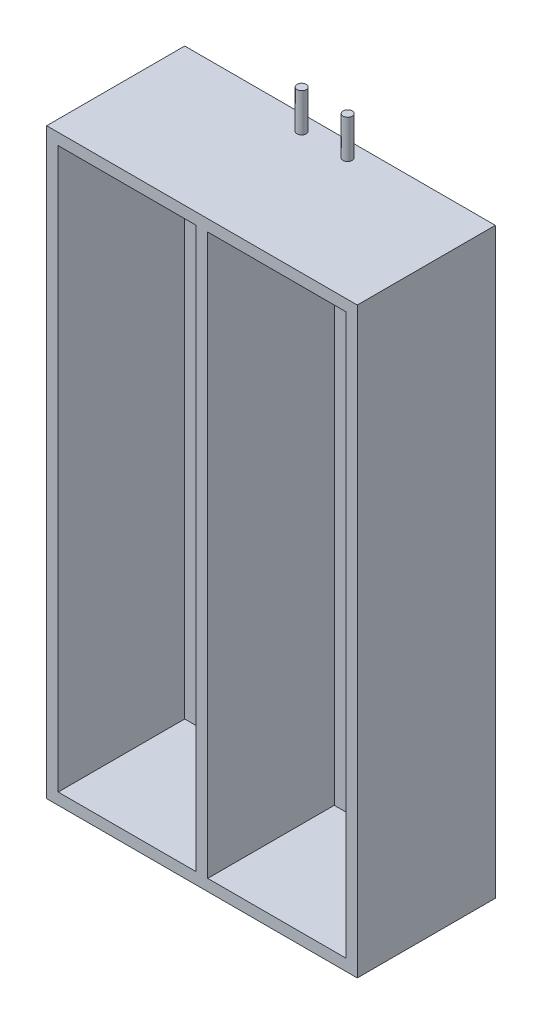
ISO-10303-21;
HEADER;
FILE_DESCRIPTION(('STEP AP214'),'2;1');
FILE_NAME('part.step','',(''),(''),'','','');
FILE_SCHEMA(('AUTOMOTIVE_DESIGN { 1 0 10303 214 1 1 1 1 }'));
ENDSEC;
DATA;
#1=APPLICATION_CONTEXT('core data for automotive mechanical design processes');
#2=APPLICATION_PROTOCOL_DEFINITION('international standard','automotive_design',2000,#1);
#3=PRODUCT_CONTEXT('',#1,'mechanical');
#4=PRODUCT('Part','Part','',(#3));
#5=PRODUCT_RELATED_PRODUCT_CATEGORY('part','',(#4));
#6=PRODUCT_DEFINITION_FORMATION('','',#4);
#7=PRODUCT_DEFINITION_CONTEXT('part definition',#1,'design');
#8=PRODUCT_DEFINITION('design','',#6,#7);
#9=PRODUCT_DEFINITION_SHAPE('','',#8);
#10=(LENGTH_UNIT() NAMED_UNIT(*) SI_UNIT(.MILLI.,.METRE.));
#11=(NAMED_UNIT(*) PLANE_ANGLE_UNIT() SI_UNIT($,.RADIAN.));
#12=(NAMED_UNIT(*) SI_UNIT($,.STERADIAN.) SOLID_ANGLE_UNIT());
#13=UNCERTAINTY_MEASURE_WITH_UNIT(LENGTH_MEASURE(1.E-05),#10,'distance_accuracy_value','');
#14=(GEOMETRIC_REPRESENTATION_CONTEXT(3) GLOBAL_UNCERTAINTY_ASSIGNED_CONTEXT((#13)) GLOBAL_UNIT_ASSIGNED_CONTEXT((#10,
#11,#12)) REPRESENTATION_CONTEXT('',''));
#15=CARTESIAN_POINT('',(0.,0.,0.));
#16=DIRECTION('',(0.,0.,1.));
#17=DIRECTION('',(1.,0.,0.));
#18=AXIS2_PLACEMENT_3D('',#15,#16,#17);
#19=CARTESIAN_POINT('',(20.25,36.5,9.));
#20=DIRECTION('',(0.,-1.,0.));
#21=DIRECTION('',(0.,0.,-1.));
#22=AXIS2_PLACEMENT_3D('',#19,#20,#21);
#23=PLANE('',#22);
#24=DIRECTION('',(-1.,0.,0.));
#25=VECTOR('',#24,1.);
#26=CARTESIAN_POINT('',(0.,36.5,9.));
#27=LINE('',#26,#25);
#28=CARTESIAN_POINT('',(18.75,36.5,9.));
#29=VERTEX_POINT('',#28);
#30=CARTESIAN_POINT('',(0.750000000000004,36.5,9.));
#31=VERTEX_POINT('',#30);
#32=EDGE_CURVE('E73',#29,#31,#27,.T.);
#33=ORIENTED_EDGE('',*,*,#32,.T.);
#34=DIRECTION('',(0.,0.,-1.));
#35=VECTOR('',#34,1.);
#36=CARTESIAN_POINT('',(0.749999999999997,36.5,9.));
#37=LINE('',#36,#35);
#38=CARTESIAN_POINT('',(0.749999999999997,36.5,-7.5));
#39=VERTEX_POINT('',#38);
#40=EDGE_CURVE('E184',#31,#39,#37,.T.);
#41=ORIENTED_EDGE('',*,*,#40,.T.);
#42=DIRECTION('',(-1.,0.,0.));
#43=VECTOR('',#42,1.);
#44=CARTESIAN_POINT('',(0.,36.5,-7.5));
#45=LINE('',#44,#43);
#46=CARTESIAN_POINT('',(18.75,36.5,-7.5));
#47=VERTEX_POINT('',#46);
#48=EDGE_CURVE('E188',#47,#39,#45,.T.);
#49=ORIENTED_EDGE('',*,*,#48,.F.);
#50=DIRECTION('',(0.,0.,-1.));
#51=VECTOR('',#50,1.);
#52=CARTESIAN_POINT('',(18.75,36.5,9.));
#53=LINE('',#52,#51);
#54=EDGE_CURVE('E198',#29,#47,#53,.T.);
#55=ORIENTED_EDGE('',*,*,#54,.F.);
#56=EDGE_LOOP('',(#33,#41,#49,#55));
#57=FACE_BOUND('',#56,.T.);
#58=ADVANCED_FACE('F49',(#57),#23,.T.);
#59=CARTESIAN_POINT('',(-0.749999999999999,36.5,-7.5));
#60=VERTEX_POINT('',#59);
#61=CARTESIAN_POINT('',(-18.75,36.5,-7.5));
#62=VERTEX_POINT('',#61);
#63=EDGE_CURVE('E187',#60,#62,#45,.T.);
#64=ORIENTED_EDGE('',*,*,#63,.F.);
#65=DIRECTION('',(0.,0.,-1.));
#66=VECTOR('',#65,1.);
#67=CARTESIAN_POINT('',(-0.750000000000005,36.5,9.));
#68=LINE('',#67,#66);
#69=CARTESIAN_POINT('',(-0.750000000000004,36.5,9.));
#70=VERTEX_POINT('',#69);
#71=EDGE_CURVE('E65',#70,#60,#68,.T.);
#72=ORIENTED_EDGE('',*,*,#71,.F.);
#73=CARTESIAN_POINT('',(-18.75,36.5,9.));
#74=VERTEX_POINT('',#73);
#75=EDGE_CURVE('E213',#70,#74,#27,.T.);
#76=ORIENTED_EDGE('',*,*,#75,.T.);
#77=DIRECTION('',(0.,0.,-1.));
#78=VECTOR('',#77,1.);
#79=CARTESIAN_POINT('',(-18.75,36.5,9.));
#80=LINE('',#79,#78);
#81=EDGE_CURVE('E192',#74,#62,#80,.T.);
#82=ORIENTED_EDGE('',*,*,#81,.T.);
#83=EDGE_LOOP('',(#64,#72,#76,#82));
#84=FACE_BOUND('',#83,.T.);
#85=ADVANCED_FACE('F302',(#84),#23,.T.);
#86=CARTESIAN_POINT('',(20.25,-36.5,9.));
#87=DIRECTION('',(0.,1.,0.));
#88=DIRECTION('',(0.,0.,1.));
#89=AXIS2_PLACEMENT_3D('',#86,#87,#88);
#90=PLANE('',#89);
#91=DIRECTION('',(1.,0.,0.));
#92=VECTOR('',#91,1.);
#93=CARTESIAN_POINT('',(0.,-36.5,-7.5));
#94=LINE('',#93,#92);
#95=CARTESIAN_POINT('',(0.750000000000004,-36.5,-7.5));
#96=VERTEX_POINT('',#95);
#97=CARTESIAN_POINT('',(18.75,-36.5,-7.5));
#98=VERTEX_POINT('',#97);
#99=EDGE_CURVE('E152',#96,#98,#94,.T.);
#100=ORIENTED_EDGE('',*,*,#99,.F.);
#101=DIRECTION('',(0.,0.,-1.));
#102=VECTOR('',#101,1.);
#103=CARTESIAN_POINT('',(0.750000000000004,-36.5,9.));
#104=LINE('',#103,#102);
#105=CARTESIAN_POINT('',(0.750000000000004,-36.5,9.));
#106=VERTEX_POINT('',#105);
#107=EDGE_CURVE('E163',#106,#96,#104,.T.);
#108=ORIENTED_EDGE('',*,*,#107,.F.);
#109=DIRECTION('',(1.,0.,0.));
#110=VECTOR('',#109,1.);
#111=CARTESIAN_POINT('',(0.,-36.5,9.));
#112=LINE('',#111,#110);
#113=CARTESIAN_POINT('',(18.75,-36.5,9.));
#114=VERTEX_POINT('',#113);
#115=EDGE_CURVE('E219',#106,#114,#112,.T.);
#116=ORIENTED_EDGE('',*,*,#115,.T.);
#117=DIRECTION('',(0.,0.,-1.));
#118=VECTOR('',#117,1.);
#119=CARTESIAN_POINT('',(18.75,-36.5,9.));
#120=LINE('',#119,#118);
#121=EDGE_CURVE('E202',#114,#98,#120,.T.);
#122=ORIENTED_EDGE('',*,*,#121,.T.);
#123=EDGE_LOOP('',(#100,#108,#116,#122));
#124=FACE_BOUND('',#123,.T.);
#125=ADVANCED_FACE('F307',(#124),#90,.T.);
#126=CARTESIAN_POINT('',(-18.75,-36.5,9.));
#127=VERTEX_POINT('',#126);
#128=CARTESIAN_POINT('',(-0.750000000000004,-36.5,9.));
#129=VERTEX_POINT('',#128);
#130=EDGE_CURVE('E158',#127,#129,#112,.T.);
#131=ORIENTED_EDGE('',*,*,#130,.T.);
#132=DIRECTION('',(0.,0.,-1.));
#133=VECTOR('',#132,1.);
#134=CARTESIAN_POINT('',(-0.749999999999994,-36.5,9.));
#135=LINE('',#134,#133);
#136=CARTESIAN_POINT('',(-0.749999999999994,-36.5,-7.5));
#137=VERTEX_POINT('',#136);
#138=EDGE_CURVE('E155',#129,#137,#135,.T.);
#139=ORIENTED_EDGE('',*,*,#138,.T.);
#140=CARTESIAN_POINT('',(-18.75,-36.5,-7.5));
#141=VERTEX_POINT('',#140);
#142=EDGE_CURVE('E140',#141,#137,#94,.T.);
#143=ORIENTED_EDGE('',*,*,#142,.F.);
#144=DIRECTION('',(0.,0.,-1.));
#145=VECTOR('',#144,1.);
#146=CARTESIAN_POINT('',(-18.75,-36.5,9.));
#147=LINE('',#146,#145);
#148=EDGE_CURVE('E197',#127,#141,#147,.T.);
#149=ORIENTED_EDGE('',*,*,#148,.F.);
#150=EDGE_LOOP('',(#131,#139,#143,#149));
#151=FACE_BOUND('',#150,.T.);
#152=ADVANCED_FACE('F156',(#151),#90,.T.);
#153=CARTESIAN_POINT('',(0.,0.,-7.5));
#154=DIRECTION('',(0.,0.,-1.));
#155=DIRECTION('',(-1.,0.,0.));
#156=AXIS2_PLACEMENT_3D('',#153,#154,#155);
#157=PLANE('',#156);
#158=DIRECTION('',(0.,1.,0.));
#159=VECTOR('',#158,1.);
#160=CARTESIAN_POINT('',(0.749999999999997,36.5,-7.5));
#161=LINE('',#160,#159);
#162=EDGE_CURVE('E168',#96,#39,#161,.T.);
#163=ORIENTED_EDGE('',*,*,#162,.F.);
#164=ORIENTED_EDGE('',*,*,#99,.T.);
#165=DIRECTION('',(0.,1.,0.));
#166=VECTOR('',#165,1.);
#167=CARTESIAN_POINT('',(18.75,0.,-7.5));
#168=LINE('',#167,#166);
#169=EDGE_CURVE('E151',#98,#47,#168,.T.);
#170=ORIENTED_EDGE('',*,*,#169,.T.);
#171=ORIENTED_EDGE('',*,*,#48,.T.);
#172=EDGE_LOOP('',(#163,#164,#170,#171));
#173=FACE_BOUND('',#172,.T.);
#174=ADVANCED_FACE('F323',(#173),#157,.F.);
#175=DIRECTION('',(0.,-1.,0.));
#176=VECTOR('',#175,1.);
#177=CARTESIAN_POINT('',(-0.750000000000005,36.5,-7.5));
#178=LINE('',#177,#176);
#179=EDGE_CURVE('E144',#60,#137,#178,.T.);
#180=ORIENTED_EDGE('',*,*,#179,.F.);
#181=ORIENTED_EDGE('',*,*,#63,.T.);
#182=DIRECTION('',(0.,-1.,0.));
#183=VECTOR('',#182,1.);
#184=CARTESIAN_POINT('',(-18.75,0.,-7.5));
#185=LINE('',#184,#183);
#186=EDGE_CURVE('E146',#62,#141,#185,.T.);
#187=ORIENTED_EDGE('',*,*,#186,.T.);
#188=ORIENTED_EDGE('',*,*,#142,.T.);
#189=EDGE_LOOP('',(#180,#181,#187,#188));
#190=FACE_BOUND('',#189,.T.);
#191=ADVANCED_FACE('F142',(#190),#157,.F.);
#192=CARTESIAN_POINT('',(0.,0.,9.));
#193=DIRECTION('',(0.,0.,-1.));
#194=DIRECTION('',(-1.,0.,0.));
#195=AXIS2_PLACEMENT_3D('',#192,#193,#194);
#196=PLANE('',#195);
#197=ORIENTED_EDGE('',*,*,#75,.F.);
#198=DIRECTION('',(0.,-1.,0.));
#199=VECTOR('',#198,1.);
#200=CARTESIAN_POINT('',(-0.750000000000005,36.5,9.));
#201=LINE('',#200,#199);
#202=EDGE_CURVE('E172',#70,#129,#201,.T.);
#203=ORIENTED_EDGE('',*,*,#202,.T.);
#204=ORIENTED_EDGE('',*,*,#130,.F.);
#205=DIRECTION('',(0.,-1.,0.));
#206=VECTOR('',#205,1.);
#207=CARTESIAN_POINT('',(-18.75,0.,9.));
#208=LINE('',#207,#206);
#209=EDGE_CURVE('E216',#74,#127,#208,.T.);
#210=ORIENTED_EDGE('',*,*,#209,.F.);
#211=EDGE_LOOP('',(#197,#203,#204,#210));
#212=FACE_BOUND('',#211,.T.);
#213=DIRECTION('',(-1.,0.,0.));
#214=VECTOR('',#213,1.);
#215=CARTESIAN_POINT('',(20.25,38.,9.));
#216=LINE('',#215,#214);
#217=CARTESIAN_POINT('',(20.25,38.,9.));
#218=VERTEX_POINT('',#217);
#219=CARTESIAN_POINT('',(-20.25,38.,9.));
#220=VERTEX_POINT('',#219);
#221=EDGE_CURVE('E224',#218,#220,#216,.T.);
#222=ORIENTED_EDGE('',*,*,#221,.T.);
#223=DIRECTION('',(0.,-1.,0.));
#224=VECTOR('',#223,1.);
#225=CARTESIAN_POINT('',(-20.25,-38.,9.));
#226=LINE('',#225,#224);
#227=CARTESIAN_POINT('',(-20.25,-38.,9.));
#228=VERTEX_POINT('',#227);
#229=EDGE_CURVE('E228',#220,#228,#226,.T.);
#230=ORIENTED_EDGE('',*,*,#229,.T.);
#231=DIRECTION('',(1.,0.,0.));
#232=VECTOR('',#231,1.);
#233=CARTESIAN_POINT('',(20.25,-38.,9.));
#234=LINE('',#233,#232);
#235=CARTESIAN_POINT('',(20.25,-38.,9.));
#236=VERTEX_POINT('',#235);
#237=EDGE_CURVE('E232',#228,#236,#234,.T.);
#238=ORIENTED_EDGE('',*,*,#237,.T.);
#239=DIRECTION('',(0.,1.,0.));
#240=VECTOR('',#239,1.);
#241=CARTESIAN_POINT('',(20.25,-38.,9.));
#242=LINE('',#241,#240);
#243=EDGE_CURVE('E235',#236,#218,#242,.T.);
#244=ORIENTED_EDGE('',*,*,#243,.T.);
#245=EDGE_LOOP('',(#222,#230,#238,#244));
#246=FACE_BOUND('',#245,.T.);
#247=ORIENTED_EDGE('',*,*,#32,.F.);
#248=DIRECTION('',(0.,1.,0.));
#249=VECTOR('',#248,1.);
#250=CARTESIAN_POINT('',(18.75,0.,9.));
#251=LINE('',#250,#249);
#252=EDGE_CURVE('E203',#114,#29,#251,.T.);
#253=ORIENTED_EDGE('',*,*,#252,.F.);
#254=ORIENTED_EDGE('',*,*,#115,.F.);
#255=DIRECTION('',(0.,1.,0.));
#256=VECTOR('',#255,1.);
#257=CARTESIAN_POINT('',(0.749999999999997,36.5,9.));
#258=LINE('',#257,#256);
#259=EDGE_CURVE('E167',#106,#31,#258,.T.);
#260=ORIENTED_EDGE('',*,*,#259,.T.);
#261=EDGE_LOOP('',(#247,#253,#254,#260));
#262=FACE_BOUND('',#261,.T.);
#263=ADVANCED_FACE('F273',(#212,#246,#262),#196,.F.);
#264=CARTESIAN_POINT('',(20.25,38.,9.));
#265=DIRECTION('',(0.,-1.,0.));
#266=DIRECTION('',(0.,0.,-1.));
#267=AXIS2_PLACEMENT_3D('',#264,#265,#266);
#268=PLANE('',#267);
#269=CARTESIAN_POINT('',(-3.,38.,-7.));
#270=DIRECTION('',(0.,-1.,0.));
#271=DIRECTION('',(0.,0.,-1.));
#272=AXIS2_PLACEMENT_3D('',#269,#270,#271);
#273=CIRCLE('',#272,0.6);
#274=CARTESIAN_POINT('',(-3.,38.,-7.6));
#275=VERTEX_POINT('',#274);
#276=EDGE_CURVE('E11',#275,#275,#273,.F.);
#277=ORIENTED_EDGE('',*,*,#276,.F.);
#278=EDGE_LOOP('',(#277));
#279=FACE_BOUND('',#278,.T.);
#280=CARTESIAN_POINT('',(3.,38.,-6.99999999999999));
#281=DIRECTION('',(0.,-1.,0.));
#282=DIRECTION('',(0.,0.,-1.));
#283=AXIS2_PLACEMENT_3D('',#280,#281,#282);
#284=CIRCLE('',#283,0.6);
#285=CARTESIAN_POINT('',(3.,38.,-7.59999999999999));
#286=VERTEX_POINT('',#285);
#287=EDGE_CURVE('E58',#286,#286,#284,.F.);
#288=ORIENTED_EDGE('',*,*,#287,.F.);
#289=EDGE_LOOP('',(#288));
#290=FACE_BOUND('',#289,.T.);
#291=DIRECTION('',(-1.,0.,0.));
#292=VECTOR('',#291,1.);
#293=CARTESIAN_POINT('',(20.25,38.,-9.));
#294=LINE('',#293,#292);
#295=CARTESIAN_POINT('',(20.25,38.,-9.));
#296=VERTEX_POINT('',#295);
#297=CARTESIAN_POINT('',(-20.25,38.,-9.));
#298=VERTEX_POINT('',#297);
#299=EDGE_CURVE('E196',#296,#298,#294,.T.);
#300=ORIENTED_EDGE('',*,*,#299,.T.);
#301=DIRECTION('',(0.,0.,-1.));
#302=VECTOR('',#301,1.);
#303=CARTESIAN_POINT('',(-20.25,38.,9.));
#304=LINE('',#303,#302);
#305=EDGE_CURVE('E261',#220,#298,#304,.T.);
#306=ORIENTED_EDGE('',*,*,#305,.F.);
#307=ORIENTED_EDGE('',*,*,#221,.F.);
#308=DIRECTION('',(0.,0.,-1.));
#309=VECTOR('',#308,1.);
#310=CARTESIAN_POINT('',(20.25,38.,9.));
#311=LINE('',#310,#309);
#312=EDGE_CURVE('E238',#218,#296,#311,.T.);
#313=ORIENTED_EDGE('',*,*,#312,.T.);
#314=EDGE_LOOP('',(#300,#306,#307,#313));
#315=FACE_BOUND('',#314,.T.);
#316=ADVANCED_FACE('F51',(#279,#290,#315),#268,.F.);
#317=CARTESIAN_POINT('',(-20.25,-38.,9.));
#318=DIRECTION('',(1.,0.,0.));
#319=DIRECTION('',(0.,0.,-1.));
#320=AXIS2_PLACEMENT_3D('',#317,#318,#319);
#321=PLANE('',#320);
#322=DIRECTION('',(0.,-1.,0.));
#323=VECTOR('',#322,1.);
#324=CARTESIAN_POINT('',(-20.25,-38.,-9.));
#325=LINE('',#324,#323);
#326=CARTESIAN_POINT('',(-20.25,-38.,-9.));
#327=VERTEX_POINT('',#326);
#328=EDGE_CURVE('E242',#298,#327,#325,.T.);
#329=ORIENTED_EDGE('',*,*,#328,.T.);
#330=DIRECTION('',(0.,0.,-1.));
#331=VECTOR('',#330,1.);
#332=CARTESIAN_POINT('',(-20.25,-38.,9.));
#333=LINE('',#332,#331);
#334=EDGE_CURVE('E257',#228,#327,#333,.T.);
#335=ORIENTED_EDGE('',*,*,#334,.F.);
#336=ORIENTED_EDGE('',*,*,#229,.F.);
#337=ORIENTED_EDGE('',*,*,#305,.T.);
#338=EDGE_LOOP('',(#329,#335,#336,#337));
#339=FACE_BOUND('',#338,.T.);
#340=ADVANCED_FACE('F272',(#339),#321,.F.);
#341=CARTESIAN_POINT('',(20.25,-38.,9.));
#342=DIRECTION('',(0.,1.,0.));
#343=DIRECTION('',(0.,0.,1.));
#344=AXIS2_PLACEMENT_3D('',#341,#342,#343);
#345=PLANE('',#344);
#346=DIRECTION('',(1.,0.,0.));
#347=VECTOR('',#346,1.);
#348=CARTESIAN_POINT('',(20.25,-38.,-9.));
#349=LINE('',#348,#347);
#350=CARTESIAN_POINT('',(20.25,-38.,-9.));
#351=VERTEX_POINT('',#350);
#352=EDGE_CURVE('E245',#327,#351,#349,.T.);
#353=ORIENTED_EDGE('',*,*,#352,.T.);
#354=DIRECTION('',(0.,0.,-1.));
#355=VECTOR('',#354,1.);
#356=CARTESIAN_POINT('',(20.25,-38.,9.));
#357=LINE('',#356,#355);
#358=EDGE_CURVE('E253',#236,#351,#357,.T.);
#359=ORIENTED_EDGE('',*,*,#358,.F.);
#360=ORIENTED_EDGE('',*,*,#237,.F.);
#361=ORIENTED_EDGE('',*,*,#334,.T.);
#362=EDGE_LOOP('',(#353,#359,#360,#361));
#363=FACE_BOUND('',#362,.T.);
#364=ADVANCED_FACE('F293',(#363),#345,.F.);
#365=CARTESIAN_POINT('',(20.25,-38.,9.));
#366=DIRECTION('',(-1.,0.,0.));
#367=DIRECTION('',(0.,0.,1.));
#368=AXIS2_PLACEMENT_3D('',#365,#366,#367);
#369=PLANE('',#368);
#370=DIRECTION('',(0.,1.,0.));
#371=VECTOR('',#370,1.);
#372=CARTESIAN_POINT('',(20.25,-38.,-9.));
#373=LINE('',#372,#371);
#374=EDGE_CURVE('E229',#351,#296,#373,.T.);
#375=ORIENTED_EDGE('',*,*,#374,.T.);
#376=ORIENTED_EDGE('',*,*,#312,.F.);
#377=ORIENTED_EDGE('',*,*,#243,.F.);
#378=ORIENTED_EDGE('',*,*,#358,.T.);
#379=EDGE_LOOP('',(#375,#376,#377,#378));
#380=FACE_BOUND('',#379,.T.);
#381=ADVANCED_FACE('F291',(#380),#369,.F.);
#382=CARTESIAN_POINT('',(0.,0.,-9.));
#383=DIRECTION('',(0.,0.,-1.));
#384=DIRECTION('',(-1.,0.,0.));
#385=AXIS2_PLACEMENT_3D('',#382,#383,#384);
#386=PLANE('',#385);
#387=ORIENTED_EDGE('',*,*,#299,.F.);
#388=ORIENTED_EDGE('',*,*,#374,.F.);
#389=ORIENTED_EDGE('',*,*,#352,.F.);
#390=ORIENTED_EDGE('',*,*,#328,.F.);
#391=EDGE_LOOP('',(#387,#388,#389,#390));
#392=FACE_BOUND('',#391,.T.);
#393=ADVANCED_FACE('F281',(#392),#386,.T.);
#394=CARTESIAN_POINT('',(-18.75,-38.,9.));
#395=DIRECTION('',(1.,0.,0.));
#396=DIRECTION('',(0.,0.,-1.));
#397=AXIS2_PLACEMENT_3D('',#394,#395,#396);
#398=PLANE('',#397);
#399=ORIENTED_EDGE('',*,*,#186,.F.);
#400=ORIENTED_EDGE('',*,*,#81,.F.);
#401=ORIENTED_EDGE('',*,*,#209,.T.);
#402=ORIENTED_EDGE('',*,*,#148,.T.);
#403=EDGE_LOOP('',(#399,#400,#401,#402));
#404=FACE_BOUND('',#403,.T.);
#405=ADVANCED_FACE('F312',(#404),#398,.T.);
#406=CARTESIAN_POINT('',(18.75,-38.,9.));
#407=DIRECTION('',(-1.,0.,0.));
#408=DIRECTION('',(0.,0.,1.));
#409=AXIS2_PLACEMENT_3D('',#406,#407,#408);
#410=PLANE('',#409);
#411=ORIENTED_EDGE('',*,*,#169,.F.);
#412=ORIENTED_EDGE('',*,*,#121,.F.);
#413=ORIENTED_EDGE('',*,*,#252,.T.);
#414=ORIENTED_EDGE('',*,*,#54,.T.);
#415=EDGE_LOOP('',(#411,#412,#413,#414));
#416=FACE_BOUND('',#415,.T.);
#417=ADVANCED_FACE('F315',(#416),#410,.T.);
#418=CARTESIAN_POINT('',(0.749999999999997,36.5,9.));
#419=DIRECTION('',(-1.,0.,0.));
#420=DIRECTION('',(0.,-1.,0.));
#421=AXIS2_PLACEMENT_3D('',#418,#419,#420);
#422=PLANE('',#421);
#423=ORIENTED_EDGE('',*,*,#162,.T.);
#424=ORIENTED_EDGE('',*,*,#40,.F.);
#425=ORIENTED_EDGE('',*,*,#259,.F.);
#426=ORIENTED_EDGE('',*,*,#107,.T.);
#427=EDGE_LOOP('',(#423,#424,#425,#426));
#428=FACE_BOUND('',#427,.T.);
#429=ADVANCED_FACE('F310',(#428),#422,.F.);
#430=CARTESIAN_POINT('',(-0.750000000000005,36.5,9.));
#431=DIRECTION('',(1.,0.,0.));
#432=DIRECTION('',(0.,1.,0.));
#433=AXIS2_PLACEMENT_3D('',#430,#431,#432);
#434=PLANE('',#433);
#435=ORIENTED_EDGE('',*,*,#179,.T.);
#436=ORIENTED_EDGE('',*,*,#138,.F.);
#437=ORIENTED_EDGE('',*,*,#202,.F.);
#438=ORIENTED_EDGE('',*,*,#71,.T.);
#439=EDGE_LOOP('',(#435,#436,#437,#438));
#440=FACE_BOUND('',#439,.T.);
#441=ADVANCED_FACE('F165',(#440),#434,.F.);
#442=CARTESIAN_POINT('',(3.,43.,-6.99999999999999));
#443=DIRECTION('',(0.,-1.,0.));
#444=DIRECTION('',(0.,0.,-1.));
#445=AXIS2_PLACEMENT_3D('',#442,#443,#444);
#446=CYLINDRICAL_SURFACE('',#445,0.6);
#447=CARTESIAN_POINT('',(3.,43.,-6.99999999999999));
#448=DIRECTION('',(0.,1.,0.));
#449=DIRECTION('',(0.,0.,-1.));
#450=AXIS2_PLACEMENT_3D('',#447,#448,#449);
#451=CIRCLE('',#450,0.6);
#452=CARTESIAN_POINT('',(3.,43.,-7.59999999999999));
#453=VERTEX_POINT('',#452);
#454=EDGE_CURVE('E553',#453,#453,#451,.T.);
#455=ORIENTED_EDGE('',*,*,#454,.F.);
#456=EDGE_LOOP('',(#455));
#457=FACE_BOUND('',#456,.T.);
#458=ORIENTED_EDGE('',*,*,#287,.T.);
#459=EDGE_LOOP('',(#458));
#460=FACE_BOUND('',#459,.T.);
#461=ADVANCED_FACE('F268',(#457,#460),#446,.T.);
#462=CARTESIAN_POINT('',(3.,43.,-6.99999999999999));
#463=DIRECTION('',(0.,-1.,0.));
#464=DIRECTION('',(0.,0.,-1.));
#465=AXIS2_PLACEMENT_3D('',#462,#463,#464);
#466=PLANE('',#465);
#467=ORIENTED_EDGE('',*,*,#454,.T.);
#468=EDGE_LOOP('',(#467));
#469=FACE_BOUND('',#468,.T.);
#470=ADVANCED_FACE('F360',(#469),#466,.F.);
#471=CARTESIAN_POINT('',(-3.,43.,-7.));
#472=DIRECTION('',(0.,-1.,0.));
#473=DIRECTION('',(0.,0.,-1.));
#474=AXIS2_PLACEMENT_3D('',#471,#472,#473);
#475=CYLINDRICAL_SURFACE('',#474,0.6);
#476=CARTESIAN_POINT('',(-3.,43.,-7.));
#477=DIRECTION('',(0.,1.,0.));
#478=DIRECTION('',(0.,0.,1.));
#479=AXIS2_PLACEMENT_3D('',#476,#477,#478);
#480=CIRCLE('',#479,0.6);
#481=CARTESIAN_POINT('',(-3.,43.,-6.4));
#482=VERTEX_POINT('',#481);
#483=EDGE_CURVE('E175',#482,#482,#480,.T.);
#484=ORIENTED_EDGE('',*,*,#483,.F.);
#485=EDGE_LOOP('',(#484));
#486=FACE_BOUND('',#485,.T.);
#487=ORIENTED_EDGE('',*,*,#276,.T.);
#488=EDGE_LOOP('',(#487));
#489=FACE_BOUND('',#488,.T.);
#490=ADVANCED_FACE('F368',(#486,#489),#475,.T.);
#491=CARTESIAN_POINT('',(-3.,43.,-7.));
#492=DIRECTION('',(0.,1.,0.));
#493=DIRECTION('',(0.,0.,1.));
#494=AXIS2_PLACEMENT_3D('',#491,#492,#493);
#495=PLANE('',#494);
#496=ORIENTED_EDGE('',*,*,#483,.T.);
#497=EDGE_LOOP('',(#496));
#498=FACE_BOUND('',#497,.T.);
#499=ADVANCED_FACE('F376',(#498),#495,.T.);
#500=CLOSED_SHELL('',(#58,#85,#125,#152,#174,#191,#263,#316,#340,#364,#381,#393,#405,#417,#429,
#441,#461,#470,#490,#499));
#501=MANIFOLD_SOLID_BREP('B2',#500);
#502=ADVANCED_BREP_SHAPE_REPRESENTATION('',(#18,#501),#14);
#503=SHAPE_DEFINITION_REPRESENTATION(#9,#502);
ENDSEC;
END-ISO-10303-21;
